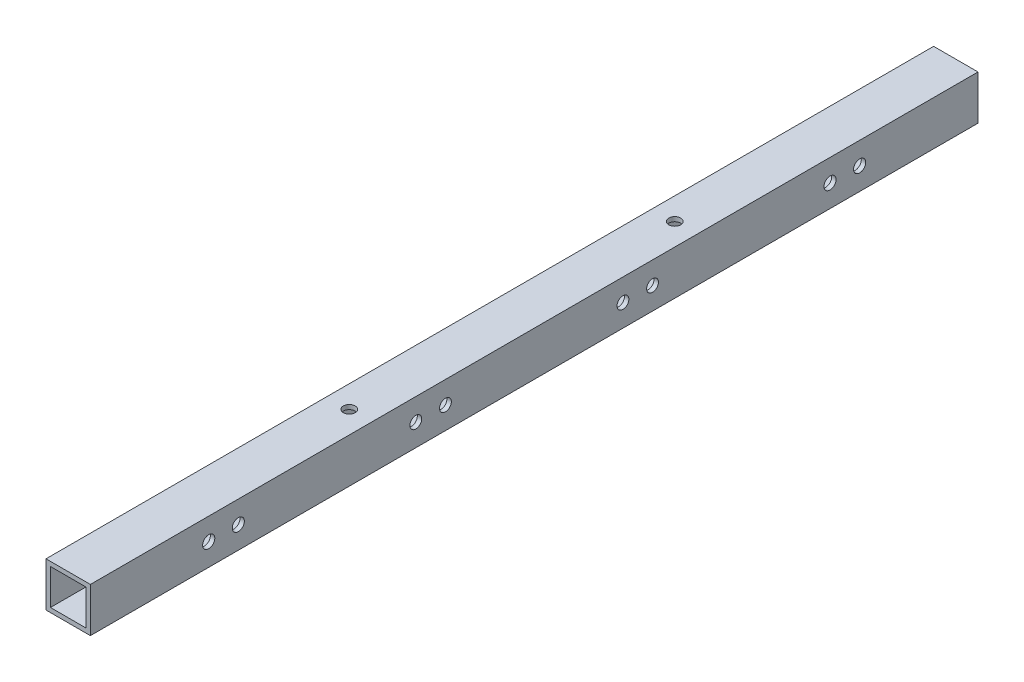
ISO-10303-21;
HEADER;
FILE_DESCRIPTION(('STEP AP214'),'2;1');
FILE_NAME('part.step','',(''),(''),'','','');
FILE_SCHEMA(('AUTOMOTIVE_DESIGN { 1 0 10303 214 1 1 1 1 }'));
ENDSEC;
DATA;
#1=APPLICATION_CONTEXT('core data for automotive mechanical design processes');
#2=APPLICATION_PROTOCOL_DEFINITION('international standard','automotive_design',2000,#1);
#3=PRODUCT_CONTEXT('',#1,'mechanical');
#4=PRODUCT('Part','Part','',(#3));
#5=PRODUCT_RELATED_PRODUCT_CATEGORY('part','',(#4));
#6=PRODUCT_DEFINITION_FORMATION('','',#4);
#7=PRODUCT_DEFINITION_CONTEXT('part definition',#1,'design');
#8=PRODUCT_DEFINITION('design','',#6,#7);
#9=PRODUCT_DEFINITION_SHAPE('','',#8);
#10=(LENGTH_UNIT() NAMED_UNIT(*) SI_UNIT(.MILLI.,.METRE.));
#11=(NAMED_UNIT(*) PLANE_ANGLE_UNIT() SI_UNIT($,.RADIAN.));
#12=(NAMED_UNIT(*) SI_UNIT($,.STERADIAN.) SOLID_ANGLE_UNIT());
#13=UNCERTAINTY_MEASURE_WITH_UNIT(LENGTH_MEASURE(1.E-05),#10,'distance_accuracy_value','');
#14=(GEOMETRIC_REPRESENTATION_CONTEXT(3) GLOBAL_UNCERTAINTY_ASSIGNED_CONTEXT((#13)) GLOBAL_UNIT_ASSIGNED_CONTEXT((#10,
#11,#12)) REPRESENTATION_CONTEXT('',''));
#15=CARTESIAN_POINT('',(0.,0.,0.));
#16=DIRECTION('',(0.,0.,1.));
#17=DIRECTION('',(1.,0.,0.));
#18=AXIS2_PLACEMENT_3D('',#15,#16,#17);
#19=CARTESIAN_POINT('',(0.,0.,300.));
#20=DIRECTION('',(0.,0.,1.));
#21=DIRECTION('',(1.,0.,0.));
#22=AXIS2_PLACEMENT_3D('',#19,#20,#21);
#23=PLANE('',#22);
#24=DIRECTION('',(0.,1.,0.));
#25=VECTOR('',#24,1.);
#26=CARTESIAN_POINT('',(7.5,7.5,300.));
#27=LINE('',#26,#25);
#28=CARTESIAN_POINT('',(7.5,-7.5,300.));
#29=VERTEX_POINT('',#28);
#30=CARTESIAN_POINT('',(7.5,7.5,300.));
#31=VERTEX_POINT('',#30);
#32=EDGE_CURVE('E138',#29,#31,#27,.T.);
#33=ORIENTED_EDGE('',*,*,#32,.T.);
#34=DIRECTION('',(-1.,0.,0.));
#35=VECTOR('',#34,1.);
#36=CARTESIAN_POINT('',(-7.5,7.5,300.));
#37=LINE('',#36,#35);
#38=CARTESIAN_POINT('',(-7.5,7.5,300.));
#39=VERTEX_POINT('',#38);
#40=EDGE_CURVE('E141',#31,#39,#37,.T.);
#41=ORIENTED_EDGE('',*,*,#40,.T.);
#42=DIRECTION('',(0.,-1.,0.));
#43=VECTOR('',#42,1.);
#44=CARTESIAN_POINT('',(-7.5,7.5,300.));
#45=LINE('',#44,#43);
#46=CARTESIAN_POINT('',(-7.5,-7.5,300.));
#47=VERTEX_POINT('',#46);
#48=EDGE_CURVE('E144',#39,#47,#45,.T.);
#49=ORIENTED_EDGE('',*,*,#48,.T.);
#50=DIRECTION('',(1.,0.,0.));
#51=VECTOR('',#50,1.);
#52=CARTESIAN_POINT('',(-7.5,-7.5,300.));
#53=LINE('',#52,#51);
#54=EDGE_CURVE('E146',#47,#29,#53,.T.);
#55=ORIENTED_EDGE('',*,*,#54,.T.);
#56=EDGE_LOOP('',(#33,#41,#49,#55));
#57=FACE_BOUND('',#56,.T.);
#58=DIRECTION('',(-1.,0.,0.));
#59=VECTOR('',#58,1.);
#60=CARTESIAN_POINT('',(-6.,6.,300.));
#61=LINE('',#60,#59);
#62=CARTESIAN_POINT('',(6.,6.,300.));
#63=VERTEX_POINT('',#62);
#64=CARTESIAN_POINT('',(-6.,6.,300.));
#65=VERTEX_POINT('',#64);
#66=EDGE_CURVE('E108',#63,#65,#61,.T.);
#67=ORIENTED_EDGE('',*,*,#66,.F.);
#68=DIRECTION('',(0.,1.,0.));
#69=VECTOR('',#68,1.);
#70=CARTESIAN_POINT('',(6.,6.,300.));
#71=LINE('',#70,#69);
#72=CARTESIAN_POINT('',(6.,-6.,300.));
#73=VERTEX_POINT('',#72);
#74=EDGE_CURVE('E100',#73,#63,#71,.T.);
#75=ORIENTED_EDGE('',*,*,#74,.F.);
#76=DIRECTION('',(1.,0.,0.));
#77=VECTOR('',#76,1.);
#78=CARTESIAN_POINT('',(-6.,-6.,300.));
#79=LINE('',#78,#77);
#80=CARTESIAN_POINT('',(-6.,-6.,300.));
#81=VERTEX_POINT('',#80);
#82=EDGE_CURVE('E122',#81,#73,#79,.T.);
#83=ORIENTED_EDGE('',*,*,#82,.F.);
#84=DIRECTION('',(0.,-1.,0.));
#85=VECTOR('',#84,1.);
#86=CARTESIAN_POINT('',(-6.,6.,300.));
#87=LINE('',#86,#85);
#88=EDGE_CURVE('E120',#65,#81,#87,.T.);
#89=ORIENTED_EDGE('',*,*,#88,.F.);
#90=EDGE_LOOP('',(#67,#75,#83,#89));
#91=FACE_BOUND('',#90,.T.);
#92=ADVANCED_FACE('F33',(#57,#91),#23,.T.);
#93=CARTESIAN_POINT('',(0.,0.,0.));
#94=DIRECTION('',(0.,0.,1.));
#95=DIRECTION('',(1.,0.,0.));
#96=AXIS2_PLACEMENT_3D('',#93,#94,#95);
#97=PLANE('',#96);
#98=DIRECTION('',(0.,1.,0.));
#99=VECTOR('',#98,1.);
#100=CARTESIAN_POINT('',(7.5,7.5,0.));
#101=LINE('',#100,#99);
#102=CARTESIAN_POINT('',(7.5,-7.5,0.));
#103=VERTEX_POINT('',#102);
#104=CARTESIAN_POINT('',(7.5,7.5,0.));
#105=VERTEX_POINT('',#104);
#106=EDGE_CURVE('E116',#103,#105,#101,.T.);
#107=ORIENTED_EDGE('',*,*,#106,.F.);
#108=DIRECTION('',(1.,0.,0.));
#109=VECTOR('',#108,1.);
#110=CARTESIAN_POINT('',(-7.5,-7.5,0.));
#111=LINE('',#110,#109);
#112=CARTESIAN_POINT('',(-7.5,-7.5,0.));
#113=VERTEX_POINT('',#112);
#114=EDGE_CURVE('E142',#113,#103,#111,.T.);
#115=ORIENTED_EDGE('',*,*,#114,.F.);
#116=DIRECTION('',(0.,-1.,0.));
#117=VECTOR('',#116,1.);
#118=CARTESIAN_POINT('',(-7.5,7.5,0.));
#119=LINE('',#118,#117);
#120=CARTESIAN_POINT('',(-7.5,7.5,0.));
#121=VERTEX_POINT('',#120);
#122=EDGE_CURVE('E153',#121,#113,#119,.T.);
#123=ORIENTED_EDGE('',*,*,#122,.F.);
#124=DIRECTION('',(-1.,0.,0.));
#125=VECTOR('',#124,1.);
#126=CARTESIAN_POINT('',(-7.5,7.5,0.));
#127=LINE('',#126,#125);
#128=EDGE_CURVE('E151',#105,#121,#127,.T.);
#129=ORIENTED_EDGE('',*,*,#128,.F.);
#130=EDGE_LOOP('',(#107,#115,#123,#129));
#131=FACE_BOUND('',#130,.T.);
#132=DIRECTION('',(0.,1.,0.));
#133=VECTOR('',#132,1.);
#134=CARTESIAN_POINT('',(6.,6.,0.));
#135=LINE('',#134,#133);
#136=CARTESIAN_POINT('',(6.,-6.,0.));
#137=VERTEX_POINT('',#136);
#138=CARTESIAN_POINT('',(6.,6.,0.));
#139=VERTEX_POINT('',#138);
#140=EDGE_CURVE('E58',#137,#139,#135,.T.);
#141=ORIENTED_EDGE('',*,*,#140,.T.);
#142=DIRECTION('',(-1.,0.,0.));
#143=VECTOR('',#142,1.);
#144=CARTESIAN_POINT('',(-6.,6.,0.));
#145=LINE('',#144,#143);
#146=CARTESIAN_POINT('',(-6.,6.,0.));
#147=VERTEX_POINT('',#146);
#148=EDGE_CURVE('E115',#139,#147,#145,.T.);
#149=ORIENTED_EDGE('',*,*,#148,.T.);
#150=DIRECTION('',(0.,-1.,0.));
#151=VECTOR('',#150,1.);
#152=CARTESIAN_POINT('',(-6.,6.,0.));
#153=LINE('',#152,#151);
#154=CARTESIAN_POINT('',(-6.,-6.,0.));
#155=VERTEX_POINT('',#154);
#156=EDGE_CURVE('E130',#147,#155,#153,.T.);
#157=ORIENTED_EDGE('',*,*,#156,.T.);
#158=DIRECTION('',(1.,0.,0.));
#159=VECTOR('',#158,1.);
#160=CARTESIAN_POINT('',(-6.,-6.,0.));
#161=LINE('',#160,#159);
#162=EDGE_CURVE('E109',#155,#137,#161,.T.);
#163=ORIENTED_EDGE('',*,*,#162,.T.);
#164=EDGE_LOOP('',(#141,#149,#157,#163));
#165=FACE_BOUND('',#164,.T.);
#166=ADVANCED_FACE('F295',(#131,#165),#97,.F.);
#167=CARTESIAN_POINT('',(7.5,7.5,300.));
#168=DIRECTION('',(-1.,0.,0.));
#169=DIRECTION('',(0.,0.,1.));
#170=AXIS2_PLACEMENT_3D('',#167,#168,#169);
#171=PLANE('',#170);
#172=CARTESIAN_POINT('',(7.5,0.,110.));
#173=DIRECTION('',(-1.,0.,0.));
#174=DIRECTION('',(0.,0.,1.));
#175=AXIS2_PLACEMENT_3D('',#172,#173,#174);
#176=CIRCLE('',#175,2.);
#177=CARTESIAN_POINT('',(7.5,0.,112.));
#178=VERTEX_POINT('',#177);
#179=EDGE_CURVE('E224',#178,#178,#176,.T.);
#180=ORIENTED_EDGE('',*,*,#179,.T.);
#181=EDGE_LOOP('',(#180));
#182=FACE_BOUND('',#181,.T.);
#183=CARTESIAN_POINT('',(7.5,0.,190.));
#184=DIRECTION('',(-1.,0.,0.));
#185=DIRECTION('',(0.,0.,1.));
#186=AXIS2_PLACEMENT_3D('',#183,#184,#185);
#187=CIRCLE('',#186,2.);
#188=CARTESIAN_POINT('',(7.5,0.,192.));
#189=VERTEX_POINT('',#188);
#190=EDGE_CURVE('E209',#189,#189,#187,.T.);
#191=ORIENTED_EDGE('',*,*,#190,.T.);
#192=EDGE_LOOP('',(#191));
#193=FACE_BOUND('',#192,.T.);
#194=CARTESIAN_POINT('',(7.5,0.,180.));
#195=DIRECTION('',(-1.,0.,0.));
#196=DIRECTION('',(0.,0.,1.));
#197=AXIS2_PLACEMENT_3D('',#194,#195,#196);
#198=CIRCLE('',#197,2.);
#199=CARTESIAN_POINT('',(7.5,0.,182.));
#200=VERTEX_POINT('',#199);
#201=EDGE_CURVE('E205',#200,#200,#198,.T.);
#202=ORIENTED_EDGE('',*,*,#201,.T.);
#203=EDGE_LOOP('',(#202));
#204=FACE_BOUND('',#203,.T.);
#205=CARTESIAN_POINT('',(7.5,0.,120.));
#206=DIRECTION('',(-1.,0.,0.));
#207=DIRECTION('',(0.,0.,1.));
#208=AXIS2_PLACEMENT_3D('',#205,#206,#207);
#209=CIRCLE('',#208,2.);
#210=CARTESIAN_POINT('',(7.5,0.,122.));
#211=VERTEX_POINT('',#210);
#212=EDGE_CURVE('E231',#211,#211,#209,.T.);
#213=ORIENTED_EDGE('',*,*,#212,.T.);
#214=EDGE_LOOP('',(#213));
#215=FACE_BOUND('',#214,.T.);
#216=CARTESIAN_POINT('',(7.50000000000001,0.,260.));
#217=DIRECTION('',(-1.,0.,0.));
#218=DIRECTION('',(0.,0.,1.));
#219=AXIS2_PLACEMENT_3D('',#216,#217,#218);
#220=CIRCLE('',#219,2.05000000000002);
#221=CARTESIAN_POINT('',(7.50000000000001,0.,262.05));
#222=VERTEX_POINT('',#221);
#223=EDGE_CURVE('E252',#222,#222,#220,.T.);
#224=ORIENTED_EDGE('',*,*,#223,.T.);
#225=EDGE_LOOP('',(#224));
#226=FACE_BOUND('',#225,.T.);
#227=CARTESIAN_POINT('',(7.50000000000001,0.,40.));
#228=DIRECTION('',(-1.,0.,0.));
#229=DIRECTION('',(0.,0.,1.));
#230=AXIS2_PLACEMENT_3D('',#227,#228,#229);
#231=CIRCLE('',#230,2.05000000000002);
#232=CARTESIAN_POINT('',(7.50000000000001,0.,42.05));
#233=VERTEX_POINT('',#232);
#234=EDGE_CURVE('E192',#233,#233,#231,.T.);
#235=ORIENTED_EDGE('',*,*,#234,.T.);
#236=EDGE_LOOP('',(#235));
#237=FACE_BOUND('',#236,.T.);
#238=CARTESIAN_POINT('',(7.50000000000001,0.,50.));
#239=DIRECTION('',(-1.,0.,0.));
#240=DIRECTION('',(0.,0.,1.));
#241=AXIS2_PLACEMENT_3D('',#238,#239,#240);
#242=CIRCLE('',#241,2.05000000000002);
#243=CARTESIAN_POINT('',(7.50000000000001,0.,52.05));
#244=VERTEX_POINT('',#243);
#245=EDGE_CURVE('E187',#244,#244,#242,.T.);
#246=ORIENTED_EDGE('',*,*,#245,.T.);
#247=EDGE_LOOP('',(#246));
#248=FACE_BOUND('',#247,.T.);
#249=CARTESIAN_POINT('',(7.50000000000001,0.,250.));
#250=DIRECTION('',(-1.,0.,0.));
#251=DIRECTION('',(0.,0.,1.));
#252=AXIS2_PLACEMENT_3D('',#249,#250,#251);
#253=CIRCLE('',#252,2.05000000000002);
#254=CARTESIAN_POINT('',(7.50000000000001,0.,252.05));
#255=VERTEX_POINT('',#254);
#256=EDGE_CURVE('E259',#255,#255,#253,.T.);
#257=ORIENTED_EDGE('',*,*,#256,.T.);
#258=EDGE_LOOP('',(#257));
#259=FACE_BOUND('',#258,.T.);
#260=ORIENTED_EDGE('',*,*,#106,.T.);
#261=DIRECTION('',(0.,0.,-1.));
#262=VECTOR('',#261,1.);
#263=CARTESIAN_POINT('',(7.5,7.5,300.));
#264=LINE('',#263,#262);
#265=EDGE_CURVE('E11',#31,#105,#264,.T.);
#266=ORIENTED_EDGE('',*,*,#265,.F.);
#267=ORIENTED_EDGE('',*,*,#32,.F.);
#268=DIRECTION('',(0.,0.,-1.));
#269=VECTOR('',#268,1.);
#270=CARTESIAN_POINT('',(7.5,-7.5,300.));
#271=LINE('',#270,#269);
#272=EDGE_CURVE('E148',#29,#103,#271,.T.);
#273=ORIENTED_EDGE('',*,*,#272,.T.);
#274=EDGE_LOOP('',(#260,#266,#267,#273));
#275=FACE_BOUND('',#274,.T.);
#276=ADVANCED_FACE('F35',(#182,#193,#204,#215,#226,#237,#248,#259,#275),#171,.F.);
#277=CARTESIAN_POINT('',(-7.5,7.5,300.));
#278=DIRECTION('',(0.,-1.,0.));
#279=DIRECTION('',(0.,0.,-1.));
#280=AXIS2_PLACEMENT_3D('',#277,#278,#279);
#281=PLANE('',#280);
#282=CARTESIAN_POINT('',(0.,7.5,95.));
#283=DIRECTION('',(0.,1.,0.));
#284=DIRECTION('',(0.,0.,-1.));
#285=AXIS2_PLACEMENT_3D('',#282,#283,#284);
#286=CIRCLE('',#285,2.);
#287=CARTESIAN_POINT('',(0.,7.5,93.));
#288=VERTEX_POINT('',#287);
#289=EDGE_CURVE('E172',#288,#288,#286,.T.);
#290=ORIENTED_EDGE('',*,*,#289,.F.);
#291=EDGE_LOOP('',(#290));
#292=FACE_BOUND('',#291,.T.);
#293=CARTESIAN_POINT('',(0.,7.5,205.));
#294=DIRECTION('',(0.,1.,0.));
#295=DIRECTION('',(0.,0.,1.));
#296=AXIS2_PLACEMENT_3D('',#293,#294,#295);
#297=CIRCLE('',#296,2.);
#298=CARTESIAN_POINT('',(0.,7.5,207.));
#299=VERTEX_POINT('',#298);
#300=EDGE_CURVE('E167',#299,#299,#297,.T.);
#301=ORIENTED_EDGE('',*,*,#300,.F.);
#302=EDGE_LOOP('',(#301));
#303=FACE_BOUND('',#302,.T.);
#304=ORIENTED_EDGE('',*,*,#128,.T.);
#305=DIRECTION('',(0.,0.,-1.));
#306=VECTOR('',#305,1.);
#307=CARTESIAN_POINT('',(-7.5,7.5,300.));
#308=LINE('',#307,#306);
#309=EDGE_CURVE('E42',#39,#121,#308,.T.);
#310=ORIENTED_EDGE('',*,*,#309,.F.);
#311=ORIENTED_EDGE('',*,*,#40,.F.);
#312=ORIENTED_EDGE('',*,*,#265,.T.);
#313=EDGE_LOOP('',(#304,#310,#311,#312));
#314=FACE_BOUND('',#313,.T.);
#315=ADVANCED_FACE('F311',(#292,#303,#314),#281,.F.);
#316=CARTESIAN_POINT('',(-7.5,7.5,300.));
#317=DIRECTION('',(1.,0.,0.));
#318=DIRECTION('',(0.,0.,-1.));
#319=AXIS2_PLACEMENT_3D('',#316,#317,#318);
#320=PLANE('',#319);
#321=CARTESIAN_POINT('',(-7.5,0.,110.));
#322=DIRECTION('',(-1.,0.,0.));
#323=DIRECTION('',(0.,0.,1.));
#324=AXIS2_PLACEMENT_3D('',#321,#322,#323);
#325=CIRCLE('',#324,2.);
#326=CARTESIAN_POINT('',(-7.5,0.,112.));
#327=VERTEX_POINT('',#326);
#328=EDGE_CURVE('E201',#327,#327,#325,.T.);
#329=ORIENTED_EDGE('',*,*,#328,.F.);
#330=EDGE_LOOP('',(#329));
#331=FACE_BOUND('',#330,.T.);
#332=CARTESIAN_POINT('',(-7.5,0.,190.));
#333=DIRECTION('',(-1.,0.,0.));
#334=DIRECTION('',(0.,0.,-1.));
#335=AXIS2_PLACEMENT_3D('',#332,#333,#334);
#336=CIRCLE('',#335,2.);
#337=CARTESIAN_POINT('',(-7.5,0.,188.));
#338=VERTEX_POINT('',#337);
#339=EDGE_CURVE('E604',#338,#338,#336,.T.);
#340=ORIENTED_EDGE('',*,*,#339,.F.);
#341=EDGE_LOOP('',(#340));
#342=FACE_BOUND('',#341,.T.);
#343=CARTESIAN_POINT('',(-7.5,0.,180.));
#344=DIRECTION('',(-1.,0.,0.));
#345=DIRECTION('',(0.,0.,-1.));
#346=AXIS2_PLACEMENT_3D('',#343,#344,#345);
#347=CIRCLE('',#346,2.);
#348=CARTESIAN_POINT('',(-7.5,0.,178.));
#349=VERTEX_POINT('',#348);
#350=EDGE_CURVE('E607',#349,#349,#347,.T.);
#351=ORIENTED_EDGE('',*,*,#350,.F.);
#352=EDGE_LOOP('',(#351));
#353=FACE_BOUND('',#352,.T.);
#354=CARTESIAN_POINT('',(-7.5,0.,120.));
#355=DIRECTION('',(-1.,0.,0.));
#356=DIRECTION('',(0.,0.,1.));
#357=AXIS2_PLACEMENT_3D('',#354,#355,#356);
#358=CIRCLE('',#357,2.);
#359=CARTESIAN_POINT('',(-7.5,0.,122.));
#360=VERTEX_POINT('',#359);
#361=EDGE_CURVE('E197',#360,#360,#358,.T.);
#362=ORIENTED_EDGE('',*,*,#361,.F.);
#363=EDGE_LOOP('',(#362));
#364=FACE_BOUND('',#363,.T.);
#365=CARTESIAN_POINT('',(-7.5,0.,260.));
#366=DIRECTION('',(-1.,0.,0.));
#367=DIRECTION('',(0.,0.,1.));
#368=AXIS2_PLACEMENT_3D('',#365,#366,#367);
#369=CIRCLE('',#368,2.05000000000002);
#370=CARTESIAN_POINT('',(-7.5,0.,262.05));
#371=VERTEX_POINT('',#370);
#372=EDGE_CURVE('E182',#371,#371,#369,.T.);
#373=ORIENTED_EDGE('',*,*,#372,.F.);
#374=EDGE_LOOP('',(#373));
#375=FACE_BOUND('',#374,.T.);
#376=CARTESIAN_POINT('',(-7.5,0.,40.));
#377=DIRECTION('',(-1.,0.,0.));
#378=DIRECTION('',(0.,0.,-1.));
#379=AXIS2_PLACEMENT_3D('',#376,#377,#378);
#380=CIRCLE('',#379,2.05000000000002);
#381=CARTESIAN_POINT('',(-7.5,0.,37.95));
#382=VERTEX_POINT('',#381);
#383=EDGE_CURVE('E237',#382,#382,#380,.T.);
#384=ORIENTED_EDGE('',*,*,#383,.F.);
#385=EDGE_LOOP('',(#384));
#386=FACE_BOUND('',#385,.T.);
#387=CARTESIAN_POINT('',(-7.5,0.,50.));
#388=DIRECTION('',(-1.,0.,0.));
#389=DIRECTION('',(0.,0.,-1.));
#390=AXIS2_PLACEMENT_3D('',#387,#388,#389);
#391=CIRCLE('',#390,2.05000000000002);
#392=CARTESIAN_POINT('',(-7.5,0.,47.95));
#393=VERTEX_POINT('',#392);
#394=EDGE_CURVE('E234',#393,#393,#391,.T.);
#395=ORIENTED_EDGE('',*,*,#394,.F.);
#396=EDGE_LOOP('',(#395));
#397=FACE_BOUND('',#396,.T.);
#398=CARTESIAN_POINT('',(-7.5,0.,250.));
#399=DIRECTION('',(-1.,0.,0.));
#400=DIRECTION('',(0.,0.,1.));
#401=AXIS2_PLACEMENT_3D('',#398,#399,#400);
#402=CIRCLE('',#401,2.05000000000002);
#403=CARTESIAN_POINT('',(-7.5,0.,252.05));
#404=VERTEX_POINT('',#403);
#405=EDGE_CURVE('E177',#404,#404,#402,.T.);
#406=ORIENTED_EDGE('',*,*,#405,.F.);
#407=EDGE_LOOP('',(#406));
#408=FACE_BOUND('',#407,.T.);
#409=ORIENTED_EDGE('',*,*,#122,.T.);
#410=DIRECTION('',(0.,0.,-1.));
#411=VECTOR('',#410,1.);
#412=CARTESIAN_POINT('',(-7.5,-7.5,300.));
#413=LINE('',#412,#411);
#414=EDGE_CURVE('E158',#47,#113,#413,.T.);
#415=ORIENTED_EDGE('',*,*,#414,.F.);
#416=ORIENTED_EDGE('',*,*,#48,.F.);
#417=ORIENTED_EDGE('',*,*,#309,.T.);
#418=EDGE_LOOP('',(#409,#415,#416,#417));
#419=FACE_BOUND('',#418,.T.);
#420=ADVANCED_FACE('F308',(#331,#342,#353,#364,#375,#386,#397,#408,#419),#320,.F.);
#421=CARTESIAN_POINT('',(-7.5,-7.5,300.));
#422=DIRECTION('',(0.,1.,0.));
#423=DIRECTION('',(0.,0.,1.));
#424=AXIS2_PLACEMENT_3D('',#421,#422,#423);
#425=PLANE('',#424);
#426=CARTESIAN_POINT('',(0.,-7.5,95.));
#427=DIRECTION('',(0.,1.,0.));
#428=DIRECTION('',(0.,0.,1.));
#429=AXIS2_PLACEMENT_3D('',#426,#427,#428);
#430=CIRCLE('',#429,2.);
#431=CARTESIAN_POINT('',(0.,-7.5,97.));
#432=VERTEX_POINT('',#431);
#433=EDGE_CURVE('E266',#432,#432,#430,.T.);
#434=ORIENTED_EDGE('',*,*,#433,.T.);
#435=EDGE_LOOP('',(#434));
#436=FACE_BOUND('',#435,.T.);
#437=CARTESIAN_POINT('',(0.,-7.5,205.));
#438=DIRECTION('',(0.,1.,0.));
#439=DIRECTION('',(0.,0.,1.));
#440=AXIS2_PLACEMENT_3D('',#437,#438,#439);
#441=CIRCLE('',#440,2.);
#442=CARTESIAN_POINT('',(0.,-7.5,207.));
#443=VERTEX_POINT('',#442);
#444=EDGE_CURVE('E128',#443,#443,#441,.T.);
#445=ORIENTED_EDGE('',*,*,#444,.T.);
#446=EDGE_LOOP('',(#445));
#447=FACE_BOUND('',#446,.T.);
#448=ORIENTED_EDGE('',*,*,#114,.T.);
#449=ORIENTED_EDGE('',*,*,#272,.F.);
#450=ORIENTED_EDGE('',*,*,#54,.F.);
#451=ORIENTED_EDGE('',*,*,#414,.T.);
#452=EDGE_LOOP('',(#448,#449,#450,#451));
#453=FACE_BOUND('',#452,.T.);
#454=ADVANCED_FACE('F275',(#436,#447,#453),#425,.F.);
#455=CARTESIAN_POINT('',(6.,6.,300.));
#456=DIRECTION('',(-1.,0.,0.));
#457=DIRECTION('',(0.,0.,1.));
#458=AXIS2_PLACEMENT_3D('',#455,#456,#457);
#459=PLANE('',#458);
#460=CARTESIAN_POINT('',(6.,0.,110.));
#461=DIRECTION('',(-1.,0.,0.));
#462=DIRECTION('',(0.,0.,1.));
#463=AXIS2_PLACEMENT_3D('',#460,#461,#462);
#464=CIRCLE('',#463,2.);
#465=CARTESIAN_POINT('',(6.,0.,112.));
#466=VERTEX_POINT('',#465);
#467=EDGE_CURVE('E221',#466,#466,#464,.T.);
#468=ORIENTED_EDGE('',*,*,#467,.F.);
#469=EDGE_LOOP('',(#468));
#470=FACE_BOUND('',#469,.T.);
#471=CARTESIAN_POINT('',(6.,0.,190.));
#472=DIRECTION('',(-1.,0.,0.));
#473=DIRECTION('',(0.,0.,1.));
#474=AXIS2_PLACEMENT_3D('',#471,#472,#473);
#475=CIRCLE('',#474,2.);
#476=CARTESIAN_POINT('',(6.,0.,192.));
#477=VERTEX_POINT('',#476);
#478=EDGE_CURVE('E204',#477,#477,#475,.T.);
#479=ORIENTED_EDGE('',*,*,#478,.F.);
#480=EDGE_LOOP('',(#479));
#481=FACE_BOUND('',#480,.T.);
#482=CARTESIAN_POINT('',(6.,0.,180.));
#483=DIRECTION('',(-1.,0.,0.));
#484=DIRECTION('',(0.,0.,1.));
#485=AXIS2_PLACEMENT_3D('',#482,#483,#484);
#486=CIRCLE('',#485,2.);
#487=CARTESIAN_POINT('',(6.,0.,182.));
#488=VERTEX_POINT('',#487);
#489=EDGE_CURVE('E200',#488,#488,#486,.T.);
#490=ORIENTED_EDGE('',*,*,#489,.F.);
#491=EDGE_LOOP('',(#490));
#492=FACE_BOUND('',#491,.T.);
#493=CARTESIAN_POINT('',(6.,0.,120.));
#494=DIRECTION('',(-1.,0.,0.));
#495=DIRECTION('',(0.,0.,1.));
#496=AXIS2_PLACEMENT_3D('',#493,#494,#495);
#497=CIRCLE('',#496,2.);
#498=CARTESIAN_POINT('',(6.,0.,122.));
#499=VERTEX_POINT('',#498);
#500=EDGE_CURVE('E196',#499,#499,#497,.T.);
#501=ORIENTED_EDGE('',*,*,#500,.F.);
#502=EDGE_LOOP('',(#501));
#503=FACE_BOUND('',#502,.T.);
#504=CARTESIAN_POINT('',(6.00000000000001,0.,260.));
#505=DIRECTION('',(-1.,0.,0.));
#506=DIRECTION('',(0.,0.,1.));
#507=AXIS2_PLACEMENT_3D('',#504,#505,#506);
#508=CIRCLE('',#507,2.05000000000002);
#509=CARTESIAN_POINT('',(6.00000000000001,0.,262.05));
#510=VERTEX_POINT('',#509);
#511=EDGE_CURVE('E191',#510,#510,#508,.T.);
#512=ORIENTED_EDGE('',*,*,#511,.F.);
#513=EDGE_LOOP('',(#512));
#514=FACE_BOUND('',#513,.T.);
#515=CARTESIAN_POINT('',(6.00000000000001,0.,40.));
#516=DIRECTION('',(-1.,0.,0.));
#517=DIRECTION('',(0.,0.,1.));
#518=AXIS2_PLACEMENT_3D('',#515,#516,#517);
#519=CIRCLE('',#518,2.05000000000002);
#520=CARTESIAN_POINT('',(6.00000000000001,0.,42.05));
#521=VERTEX_POINT('',#520);
#522=EDGE_CURVE('E186',#521,#521,#519,.T.);
#523=ORIENTED_EDGE('',*,*,#522,.F.);
#524=EDGE_LOOP('',(#523));
#525=FACE_BOUND('',#524,.T.);
#526=CARTESIAN_POINT('',(6.00000000000001,0.,50.));
#527=DIRECTION('',(-1.,0.,0.));
#528=DIRECTION('',(0.,0.,1.));
#529=AXIS2_PLACEMENT_3D('',#526,#527,#528);
#530=CIRCLE('',#529,2.05000000000002);
#531=CARTESIAN_POINT('',(6.00000000000001,0.,52.05));
#532=VERTEX_POINT('',#531);
#533=EDGE_CURVE('E181',#532,#532,#530,.T.);
#534=ORIENTED_EDGE('',*,*,#533,.F.);
#535=EDGE_LOOP('',(#534));
#536=FACE_BOUND('',#535,.T.);
#537=CARTESIAN_POINT('',(6.00000000000001,0.,250.));
#538=DIRECTION('',(-1.,0.,0.));
#539=DIRECTION('',(0.,0.,1.));
#540=AXIS2_PLACEMENT_3D('',#537,#538,#539);
#541=CIRCLE('',#540,2.05000000000002);
#542=CARTESIAN_POINT('',(6.00000000000001,0.,252.05));
#543=VERTEX_POINT('',#542);
#544=EDGE_CURVE('E176',#543,#543,#541,.T.);
#545=ORIENTED_EDGE('',*,*,#544,.F.);
#546=EDGE_LOOP('',(#545));
#547=FACE_BOUND('',#546,.T.);
#548=ORIENTED_EDGE('',*,*,#140,.F.);
#549=DIRECTION('',(0.,0.,-1.));
#550=VECTOR('',#549,1.);
#551=CARTESIAN_POINT('',(6.,-6.,300.));
#552=LINE('',#551,#550);
#553=EDGE_CURVE('E104',#73,#137,#552,.T.);
#554=ORIENTED_EDGE('',*,*,#553,.F.);
#555=ORIENTED_EDGE('',*,*,#74,.T.);
#556=DIRECTION('',(0.,0.,-1.));
#557=VECTOR('',#556,1.);
#558=CARTESIAN_POINT('',(6.,6.,300.));
#559=LINE('',#558,#557);
#560=EDGE_CURVE('E103',#63,#139,#559,.T.);
#561=ORIENTED_EDGE('',*,*,#560,.T.);
#562=EDGE_LOOP('',(#548,#554,#555,#561));
#563=FACE_BOUND('',#562,.T.);
#564=ADVANCED_FACE('F102',(#470,#481,#492,#503,#514,#525,#536,#547,#563),#459,.T.);
#565=CARTESIAN_POINT('',(-6.,6.,300.));
#566=DIRECTION('',(0.,-1.,0.));
#567=DIRECTION('',(0.,0.,-1.));
#568=AXIS2_PLACEMENT_3D('',#565,#566,#567);
#569=PLANE('',#568);
#570=CARTESIAN_POINT('',(0.,6.,95.));
#571=DIRECTION('',(0.,-1.,0.));
#572=DIRECTION('',(0.,0.,-1.));
#573=AXIS2_PLACEMENT_3D('',#570,#571,#572);
#574=CIRCLE('',#573,2.);
#575=CARTESIAN_POINT('',(0.,6.,93.));
#576=VERTEX_POINT('',#575);
#577=EDGE_CURVE('E171',#576,#576,#574,.T.);
#578=ORIENTED_EDGE('',*,*,#577,.F.);
#579=EDGE_LOOP('',(#578));
#580=FACE_BOUND('',#579,.T.);
#581=CARTESIAN_POINT('',(0.,6.,205.));
#582=DIRECTION('',(0.,-1.,0.));
#583=DIRECTION('',(0.,0.,-1.));
#584=AXIS2_PLACEMENT_3D('',#581,#582,#583);
#585=CIRCLE('',#584,2.);
#586=CARTESIAN_POINT('',(0.,6.,203.));
#587=VERTEX_POINT('',#586);
#588=EDGE_CURVE('E166',#587,#587,#585,.T.);
#589=ORIENTED_EDGE('',*,*,#588,.F.);
#590=EDGE_LOOP('',(#589));
#591=FACE_BOUND('',#590,.T.);
#592=ORIENTED_EDGE('',*,*,#148,.F.);
#593=ORIENTED_EDGE('',*,*,#560,.F.);
#594=ORIENTED_EDGE('',*,*,#66,.T.);
#595=DIRECTION('',(0.,0.,-1.));
#596=VECTOR('',#595,1.);
#597=CARTESIAN_POINT('',(-6.,6.,300.));
#598=LINE('',#597,#596);
#599=EDGE_CURVE('E117',#65,#147,#598,.T.);
#600=ORIENTED_EDGE('',*,*,#599,.T.);
#601=EDGE_LOOP('',(#592,#593,#594,#600));
#602=FACE_BOUND('',#601,.T.);
#603=ADVANCED_FACE('F112',(#580,#591,#602),#569,.T.);
#604=CARTESIAN_POINT('',(-6.,6.,300.));
#605=DIRECTION('',(1.,0.,0.));
#606=DIRECTION('',(0.,0.,-1.));
#607=AXIS2_PLACEMENT_3D('',#604,#605,#606);
#608=PLANE('',#607);
#609=CARTESIAN_POINT('',(-6.,0.,110.));
#610=DIRECTION('',(1.,0.,0.));
#611=DIRECTION('',(0.,0.,-1.));
#612=AXIS2_PLACEMENT_3D('',#609,#610,#611);
#613=CIRCLE('',#612,2.);
#614=CARTESIAN_POINT('',(-6.,0.,108.));
#615=VERTEX_POINT('',#614);
#616=EDGE_CURVE('E37',#615,#615,#613,.T.);
#617=ORIENTED_EDGE('',*,*,#616,.F.);
#618=EDGE_LOOP('',(#617));
#619=FACE_BOUND('',#618,.T.);
#620=CARTESIAN_POINT('',(-6.,0.,190.));
#621=DIRECTION('',(1.,0.,0.));
#622=DIRECTION('',(0.,0.,-1.));
#623=AXIS2_PLACEMENT_3D('',#620,#621,#622);
#624=CIRCLE('',#623,2.);
#625=CARTESIAN_POINT('',(-6.,0.,188.));
#626=VERTEX_POINT('',#625);
#627=EDGE_CURVE('E202',#626,#626,#624,.T.);
#628=ORIENTED_EDGE('',*,*,#627,.F.);
#629=EDGE_LOOP('',(#628));
#630=FACE_BOUND('',#629,.T.);
#631=CARTESIAN_POINT('',(-6.,0.,180.));
#632=DIRECTION('',(1.,0.,0.));
#633=DIRECTION('',(0.,0.,-1.));
#634=AXIS2_PLACEMENT_3D('',#631,#632,#633);
#635=CIRCLE('',#634,2.);
#636=CARTESIAN_POINT('',(-6.,0.,178.));
#637=VERTEX_POINT('',#636);
#638=EDGE_CURVE('E198',#637,#637,#635,.T.);
#639=ORIENTED_EDGE('',*,*,#638,.F.);
#640=EDGE_LOOP('',(#639));
#641=FACE_BOUND('',#640,.T.);
#642=CARTESIAN_POINT('',(-6.,0.,120.));
#643=DIRECTION('',(1.,0.,0.));
#644=DIRECTION('',(0.,0.,-1.));
#645=AXIS2_PLACEMENT_3D('',#642,#643,#644);
#646=CIRCLE('',#645,2.);
#647=CARTESIAN_POINT('',(-6.,0.,118.));
#648=VERTEX_POINT('',#647);
#649=EDGE_CURVE('E193',#648,#648,#646,.T.);
#650=ORIENTED_EDGE('',*,*,#649,.F.);
#651=EDGE_LOOP('',(#650));
#652=FACE_BOUND('',#651,.T.);
#653=CARTESIAN_POINT('',(-5.99999999999999,0.,260.));
#654=DIRECTION('',(1.,0.,0.));
#655=DIRECTION('',(0.,0.,-1.));
#656=AXIS2_PLACEMENT_3D('',#653,#654,#655);
#657=CIRCLE('',#656,2.05000000000002);
#658=CARTESIAN_POINT('',(-5.99999999999999,0.,257.95));
#659=VERTEX_POINT('',#658);
#660=EDGE_CURVE('E188',#659,#659,#657,.T.);
#661=ORIENTED_EDGE('',*,*,#660,.F.);
#662=EDGE_LOOP('',(#661));
#663=FACE_BOUND('',#662,.T.);
#664=CARTESIAN_POINT('',(-5.99999999999999,0.,40.));
#665=DIRECTION('',(1.,0.,0.));
#666=DIRECTION('',(0.,0.,-1.));
#667=AXIS2_PLACEMENT_3D('',#664,#665,#666);
#668=CIRCLE('',#667,2.05000000000002);
#669=CARTESIAN_POINT('',(-5.99999999999999,0.,37.95));
#670=VERTEX_POINT('',#669);
#671=EDGE_CURVE('E183',#670,#670,#668,.T.);
#672=ORIENTED_EDGE('',*,*,#671,.F.);
#673=EDGE_LOOP('',(#672));
#674=FACE_BOUND('',#673,.T.);
#675=CARTESIAN_POINT('',(-5.99999999999999,0.,50.));
#676=DIRECTION('',(1.,0.,0.));
#677=DIRECTION('',(0.,0.,-1.));
#678=AXIS2_PLACEMENT_3D('',#675,#676,#677);
#679=CIRCLE('',#678,2.05000000000002);
#680=CARTESIAN_POINT('',(-5.99999999999999,0.,47.95));
#681=VERTEX_POINT('',#680);
#682=EDGE_CURVE('E178',#681,#681,#679,.T.);
#683=ORIENTED_EDGE('',*,*,#682,.F.);
#684=EDGE_LOOP('',(#683));
#685=FACE_BOUND('',#684,.T.);
#686=CARTESIAN_POINT('',(-5.99999999999999,0.,250.));
#687=DIRECTION('',(1.,0.,0.));
#688=DIRECTION('',(0.,0.,-1.));
#689=AXIS2_PLACEMENT_3D('',#686,#687,#688);
#690=CIRCLE('',#689,2.05000000000002);
#691=CARTESIAN_POINT('',(-5.99999999999999,0.,247.95));
#692=VERTEX_POINT('',#691);
#693=EDGE_CURVE('E173',#692,#692,#690,.T.);
#694=ORIENTED_EDGE('',*,*,#693,.F.);
#695=EDGE_LOOP('',(#694));
#696=FACE_BOUND('',#695,.T.);
#697=ORIENTED_EDGE('',*,*,#156,.F.);
#698=ORIENTED_EDGE('',*,*,#599,.F.);
#699=ORIENTED_EDGE('',*,*,#88,.T.);
#700=DIRECTION('',(0.,0.,-1.));
#701=VECTOR('',#700,1.);
#702=CARTESIAN_POINT('',(-6.,-6.,300.));
#703=LINE('',#702,#701);
#704=EDGE_CURVE('E50',#81,#155,#703,.T.);
#705=ORIENTED_EDGE('',*,*,#704,.T.);
#706=EDGE_LOOP('',(#697,#698,#699,#705));
#707=FACE_BOUND('',#706,.T.);
#708=ADVANCED_FACE('F290',(#619,#630,#641,#652,#663,#674,#685,#696,#707),#608,.T.);
#709=CARTESIAN_POINT('',(-6.,-6.,300.));
#710=DIRECTION('',(0.,1.,0.));
#711=DIRECTION('',(0.,0.,1.));
#712=AXIS2_PLACEMENT_3D('',#709,#710,#711);
#713=PLANE('',#712);
#714=CARTESIAN_POINT('',(0.,-6.,95.));
#715=DIRECTION('',(0.,1.,0.));
#716=DIRECTION('',(0.,0.,1.));
#717=AXIS2_PLACEMENT_3D('',#714,#715,#716);
#718=CIRCLE('',#717,2.);
#719=CARTESIAN_POINT('',(0.,-6.,97.));
#720=VERTEX_POINT('',#719);
#721=EDGE_CURVE('E168',#720,#720,#718,.T.);
#722=ORIENTED_EDGE('',*,*,#721,.F.);
#723=EDGE_LOOP('',(#722));
#724=FACE_BOUND('',#723,.T.);
#725=CARTESIAN_POINT('',(0.,-6.,205.));
#726=DIRECTION('',(0.,1.,0.));
#727=DIRECTION('',(0.,0.,1.));
#728=AXIS2_PLACEMENT_3D('',#725,#726,#727);
#729=CIRCLE('',#728,2.);
#730=CARTESIAN_POINT('',(0.,-6.,207.));
#731=VERTEX_POINT('',#730);
#732=EDGE_CURVE('E163',#731,#731,#729,.T.);
#733=ORIENTED_EDGE('',*,*,#732,.F.);
#734=EDGE_LOOP('',(#733));
#735=FACE_BOUND('',#734,.T.);
#736=ORIENTED_EDGE('',*,*,#162,.F.);
#737=ORIENTED_EDGE('',*,*,#704,.F.);
#738=ORIENTED_EDGE('',*,*,#82,.T.);
#739=ORIENTED_EDGE('',*,*,#553,.T.);
#740=EDGE_LOOP('',(#736,#737,#738,#739));
#741=FACE_BOUND('',#740,.T.);
#742=ADVANCED_FACE('F281',(#724,#735,#741),#713,.T.);
#743=CARTESIAN_POINT('',(0.,-22.5,205.));
#744=DIRECTION('',(0.,1.,0.));
#745=DIRECTION('',(0.,0.,1.));
#746=AXIS2_PLACEMENT_3D('',#743,#744,#745);
#747=CYLINDRICAL_SURFACE('',#746,2.);
#748=ORIENTED_EDGE('',*,*,#732,.T.);
#749=EDGE_LOOP('',(#748));
#750=FACE_BOUND('',#749,.T.);
#751=ORIENTED_EDGE('',*,*,#444,.F.);
#752=EDGE_LOOP('',(#751));
#753=FACE_BOUND('',#752,.T.);
#754=ADVANCED_FACE('F278',(#750,#753),#747,.F.);
#755=ORIENTED_EDGE('',*,*,#588,.T.);
#756=EDGE_LOOP('',(#755));
#757=FACE_BOUND('',#756,.T.);
#758=ORIENTED_EDGE('',*,*,#300,.T.);
#759=EDGE_LOOP('',(#758));
#760=FACE_BOUND('',#759,.T.);
#761=ADVANCED_FACE('F280',(#757,#760),#747,.F.);
#762=CARTESIAN_POINT('',(0.,-22.5,95.));
#763=DIRECTION('',(0.,1.,0.));
#764=DIRECTION('',(0.,0.,1.));
#765=AXIS2_PLACEMENT_3D('',#762,#763,#764);
#766=CYLINDRICAL_SURFACE('',#765,2.);
#767=ORIENTED_EDGE('',*,*,#721,.T.);
#768=EDGE_LOOP('',(#767));
#769=FACE_BOUND('',#768,.T.);
#770=ORIENTED_EDGE('',*,*,#433,.F.);
#771=EDGE_LOOP('',(#770));
#772=FACE_BOUND('',#771,.T.);
#773=ADVANCED_FACE('F288',(#769,#772),#766,.F.);
#774=ORIENTED_EDGE('',*,*,#577,.T.);
#775=EDGE_LOOP('',(#774));
#776=FACE_BOUND('',#775,.T.);
#777=ORIENTED_EDGE('',*,*,#289,.T.);
#778=EDGE_LOOP('',(#777));
#779=FACE_BOUND('',#778,.T.);
#780=ADVANCED_FACE('F365',(#776,#779),#766,.F.);
#781=CARTESIAN_POINT('',(112.5,0.,250.));
#782=DIRECTION('',(-1.,0.,0.));
#783=DIRECTION('',(0.,0.,1.));
#784=AXIS2_PLACEMENT_3D('',#781,#782,#783);
#785=CYLINDRICAL_SURFACE('',#784,2.05000000000002);
#786=ORIENTED_EDGE('',*,*,#693,.T.);
#787=EDGE_LOOP('',(#786));
#788=FACE_BOUND('',#787,.T.);
#789=ORIENTED_EDGE('',*,*,#405,.T.);
#790=EDGE_LOOP('',(#789));
#791=FACE_BOUND('',#790,.T.);
#792=ADVANCED_FACE('F361',(#788,#791),#785,.F.);
#793=ORIENTED_EDGE('',*,*,#544,.T.);
#794=EDGE_LOOP('',(#793));
#795=FACE_BOUND('',#794,.T.);
#796=ORIENTED_EDGE('',*,*,#256,.F.);
#797=EDGE_LOOP('',(#796));
#798=FACE_BOUND('',#797,.T.);
#799=ADVANCED_FACE('F364',(#795,#798),#785,.F.);
#800=CARTESIAN_POINT('',(112.5,0.,50.));
#801=DIRECTION('',(-1.,0.,0.));
#802=DIRECTION('',(0.,0.,1.));
#803=AXIS2_PLACEMENT_3D('',#800,#801,#802);
#804=CYLINDRICAL_SURFACE('',#803,2.05000000000002);
#805=ORIENTED_EDGE('',*,*,#682,.T.);
#806=EDGE_LOOP('',(#805));
#807=FACE_BOUND('',#806,.T.);
#808=ORIENTED_EDGE('',*,*,#394,.T.);
#809=EDGE_LOOP('',(#808));
#810=FACE_BOUND('',#809,.T.);
#811=ADVANCED_FACE('F373',(#807,#810),#804,.F.);
#812=CARTESIAN_POINT('',(112.5,0.,40.));
#813=DIRECTION('',(-1.,0.,0.));
#814=DIRECTION('',(0.,0.,1.));
#815=AXIS2_PLACEMENT_3D('',#812,#813,#814);
#816=CYLINDRICAL_SURFACE('',#815,2.05000000000002);
#817=ORIENTED_EDGE('',*,*,#671,.T.);
#818=EDGE_LOOP('',(#817));
#819=FACE_BOUND('',#818,.T.);
#820=ORIENTED_EDGE('',*,*,#383,.T.);
#821=EDGE_LOOP('',(#820));
#822=FACE_BOUND('',#821,.T.);
#823=ADVANCED_FACE('F412',(#819,#822),#816,.F.);
#824=CARTESIAN_POINT('',(112.5,0.,260.));
#825=DIRECTION('',(-1.,0.,0.));
#826=DIRECTION('',(0.,0.,1.));
#827=AXIS2_PLACEMENT_3D('',#824,#825,#826);
#828=CYLINDRICAL_SURFACE('',#827,2.05000000000002);
#829=ORIENTED_EDGE('',*,*,#660,.T.);
#830=EDGE_LOOP('',(#829));
#831=FACE_BOUND('',#830,.T.);
#832=ORIENTED_EDGE('',*,*,#372,.T.);
#833=EDGE_LOOP('',(#832));
#834=FACE_BOUND('',#833,.T.);
#835=ADVANCED_FACE('F422',(#831,#834),#828,.F.);
#836=ORIENTED_EDGE('',*,*,#533,.T.);
#837=EDGE_LOOP('',(#836));
#838=FACE_BOUND('',#837,.T.);
#839=ORIENTED_EDGE('',*,*,#245,.F.);
#840=EDGE_LOOP('',(#839));
#841=FACE_BOUND('',#840,.T.);
#842=ADVANCED_FACE('F414',(#838,#841),#804,.F.);
#843=ORIENTED_EDGE('',*,*,#522,.T.);
#844=EDGE_LOOP('',(#843));
#845=FACE_BOUND('',#844,.T.);
#846=ORIENTED_EDGE('',*,*,#234,.F.);
#847=EDGE_LOOP('',(#846));
#848=FACE_BOUND('',#847,.T.);
#849=ADVANCED_FACE('F424',(#845,#848),#816,.F.);
#850=ORIENTED_EDGE('',*,*,#511,.T.);
#851=EDGE_LOOP('',(#850));
#852=FACE_BOUND('',#851,.T.);
#853=ORIENTED_EDGE('',*,*,#223,.F.);
#854=EDGE_LOOP('',(#853));
#855=FACE_BOUND('',#854,.T.);
#856=ADVANCED_FACE('F434',(#852,#855),#828,.F.);
#857=CARTESIAN_POINT('',(41.5,0.,120.));
#858=DIRECTION('',(-1.,0.,0.));
#859=DIRECTION('',(0.,0.,1.));
#860=AXIS2_PLACEMENT_3D('',#857,#858,#859);
#861=CYLINDRICAL_SURFACE('',#860,2.);
#862=ORIENTED_EDGE('',*,*,#649,.T.);
#863=EDGE_LOOP('',(#862));
#864=FACE_BOUND('',#863,.T.);
#865=ORIENTED_EDGE('',*,*,#361,.T.);
#866=EDGE_LOOP('',(#865));
#867=FACE_BOUND('',#866,.T.);
#868=ADVANCED_FACE('F458',(#864,#867),#861,.F.);
#869=ORIENTED_EDGE('',*,*,#500,.T.);
#870=EDGE_LOOP('',(#869));
#871=FACE_BOUND('',#870,.T.);
#872=ORIENTED_EDGE('',*,*,#212,.F.);
#873=EDGE_LOOP('',(#872));
#874=FACE_BOUND('',#873,.T.);
#875=ADVANCED_FACE('F496',(#871,#874),#861,.F.);
#876=CARTESIAN_POINT('',(41.5,0.,180.));
#877=DIRECTION('',(-1.,0.,0.));
#878=DIRECTION('',(0.,0.,1.));
#879=AXIS2_PLACEMENT_3D('',#876,#877,#878);
#880=CYLINDRICAL_SURFACE('',#879,2.);
#881=ORIENTED_EDGE('',*,*,#638,.T.);
#882=EDGE_LOOP('',(#881));
#883=FACE_BOUND('',#882,.T.);
#884=ORIENTED_EDGE('',*,*,#350,.T.);
#885=EDGE_LOOP('',(#884));
#886=FACE_BOUND('',#885,.T.);
#887=ADVANCED_FACE('F506',(#883,#886),#880,.F.);
#888=CARTESIAN_POINT('',(41.5,0.,190.));
#889=DIRECTION('',(-1.,0.,0.));
#890=DIRECTION('',(0.,0.,1.));
#891=AXIS2_PLACEMENT_3D('',#888,#889,#890);
#892=CYLINDRICAL_SURFACE('',#891,2.);
#893=ORIENTED_EDGE('',*,*,#627,.T.);
#894=EDGE_LOOP('',(#893));
#895=FACE_BOUND('',#894,.T.);
#896=ORIENTED_EDGE('',*,*,#339,.T.);
#897=EDGE_LOOP('',(#896));
#898=FACE_BOUND('',#897,.T.);
#899=ADVANCED_FACE('F515',(#895,#898),#892,.F.);
#900=CARTESIAN_POINT('',(41.5,0.,110.));
#901=DIRECTION('',(-1.,0.,0.));
#902=DIRECTION('',(0.,0.,1.));
#903=AXIS2_PLACEMENT_3D('',#900,#901,#902);
#904=CYLINDRICAL_SURFACE('',#903,2.);
#905=ORIENTED_EDGE('',*,*,#616,.T.);
#906=EDGE_LOOP('',(#905));
#907=FACE_BOUND('',#906,.T.);
#908=ORIENTED_EDGE('',*,*,#328,.T.);
#909=EDGE_LOOP('',(#908));
#910=FACE_BOUND('',#909,.T.);
#911=ADVANCED_FACE('F526',(#907,#910),#904,.F.);
#912=ORIENTED_EDGE('',*,*,#489,.T.);
#913=EDGE_LOOP('',(#912));
#914=FACE_BOUND('',#913,.T.);
#915=ORIENTED_EDGE('',*,*,#201,.F.);
#916=EDGE_LOOP('',(#915));
#917=FACE_BOUND('',#916,.T.);
#918=ADVANCED_FACE('F518',(#914,#917),#880,.F.);
#919=ORIENTED_EDGE('',*,*,#478,.T.);
#920=EDGE_LOOP('',(#919));
#921=FACE_BOUND('',#920,.T.);
#922=ORIENTED_EDGE('',*,*,#190,.F.);
#923=EDGE_LOOP('',(#922));
#924=FACE_BOUND('',#923,.T.);
#925=ADVANCED_FACE('F528',(#921,#924),#892,.F.);
#926=ORIENTED_EDGE('',*,*,#467,.T.);
#927=EDGE_LOOP('',(#926));
#928=FACE_BOUND('',#927,.T.);
#929=ORIENTED_EDGE('',*,*,#179,.F.);
#930=EDGE_LOOP('',(#929));
#931=FACE_BOUND('',#930,.T.);
#932=ADVANCED_FACE('F538',(#928,#931),#904,.F.);
#933=CLOSED_SHELL('',(#92,#166,#276,#315,#420,#454,#564,#603,#708,#742,#754,#761,#773,#780,#792,
#799,#811,#823,#835,#842,#849,#856,#868,#875,#887,#899,#911,#918,#925,#932));
#934=MANIFOLD_SOLID_BREP('B2',#933);
#935=ADVANCED_BREP_SHAPE_REPRESENTATION('',(#18,#934),#14);
#936=SHAPE_DEFINITION_REPRESENTATION(#9,#935);
ENDSEC;
END-ISO-10303-21;
